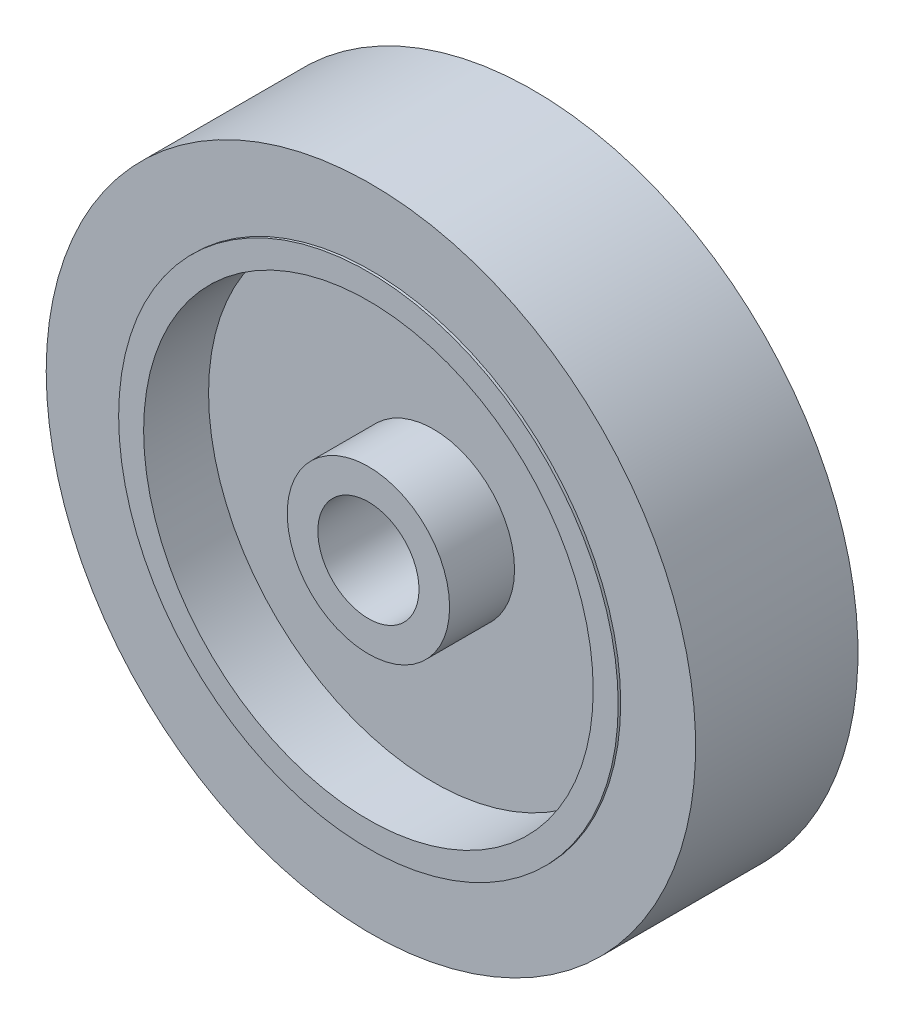
ISO-10303-21;
HEADER;
FILE_DESCRIPTION(('STEP AP214'),'2;1');
FILE_NAME('part.step','',(''),(''),'','','');
FILE_SCHEMA(('AUTOMOTIVE_DESIGN { 1 0 10303 214 1 1 1 1 }'));
ENDSEC;
DATA;
#1=APPLICATION_CONTEXT('core data for automotive mechanical design processes');
#2=APPLICATION_PROTOCOL_DEFINITION('international standard','automotive_design',2000,#1);
#3=PRODUCT_CONTEXT('',#1,'mechanical');
#4=PRODUCT('Part','Part','',(#3));
#5=PRODUCT_RELATED_PRODUCT_CATEGORY('part','',(#4));
#6=PRODUCT_DEFINITION_FORMATION('','',#4);
#7=PRODUCT_DEFINITION_CONTEXT('part definition',#1,'design');
#8=PRODUCT_DEFINITION('design','',#6,#7);
#9=PRODUCT_DEFINITION_SHAPE('','',#8);
#10=(LENGTH_UNIT() NAMED_UNIT(*) SI_UNIT(.MILLI.,.METRE.));
#11=(NAMED_UNIT(*) PLANE_ANGLE_UNIT() SI_UNIT($,.RADIAN.));
#12=(NAMED_UNIT(*) SI_UNIT($,.STERADIAN.) SOLID_ANGLE_UNIT());
#13=UNCERTAINTY_MEASURE_WITH_UNIT(LENGTH_MEASURE(1.E-05),#10,'distance_accuracy_value','');
#14=(GEOMETRIC_REPRESENTATION_CONTEXT(3) GLOBAL_UNCERTAINTY_ASSIGNED_CONTEXT((#13)) GLOBAL_UNIT_ASSIGNED_CONTEXT((#10,
#11,#12)) REPRESENTATION_CONTEXT('',''));
#15=CARTESIAN_POINT('',(0.,0.,0.));
#16=DIRECTION('',(0.,0.,1.));
#17=DIRECTION('',(1.,0.,0.));
#18=AXIS2_PLACEMENT_3D('',#15,#16,#17);
#19=CARTESIAN_POINT('',(0.,0.,6.5));
#20=DIRECTION('',(0.,0.,-1.));
#21=DIRECTION('',(-1.,0.,0.));
#22=AXIS2_PLACEMENT_3D('',#19,#20,#21);
#23=CYLINDRICAL_SURFACE('',#22,26.);
#24=CARTESIAN_POINT('',(0.,0.,6.5));
#25=DIRECTION('',(0.,0.,1.));
#26=DIRECTION('',(1.,0.,0.));
#27=AXIS2_PLACEMENT_3D('',#24,#25,#26);
#28=CIRCLE('',#27,26.);
#29=CARTESIAN_POINT('',(-26.,0.,6.5));
#30=VERTEX_POINT('',#29);
#31=EDGE_CURVE('E38',#30,#30,#28,.T.);
#32=CARTESIAN_POINT('',(0.,0.,-6.5));
#33=DIRECTION('',(0.,0.,1.));
#34=DIRECTION('',(1.,0.,0.));
#35=AXIS2_PLACEMENT_3D('',#32,#33,#34);
#36=CIRCLE('',#35,26.);
#37=CARTESIAN_POINT('',(-26.,0.,-6.5));
#38=VERTEX_POINT('',#37);
#39=EDGE_CURVE('E42',#38,#38,#36,.T.);
#40=CARTESIAN_POINT('',(-26.,0.,6.5));
#41=CARTESIAN_POINT('',(-26.,0.,6.36458333333333));
#42=CARTESIAN_POINT('',(-26.,0.,6.22916666666667));
#43=CARTESIAN_POINT('',(-26.,0.,5.95833333333333));
#44=CARTESIAN_POINT('',(-26.,0.,5.82291666666667));
#45=CARTESIAN_POINT('',(-26.,0.,5.55208333333333));
#46=CARTESIAN_POINT('',(-26.,0.,5.41666666666667));
#47=CARTESIAN_POINT('',(-26.,0.,5.14583333333333));
#48=CARTESIAN_POINT('',(-26.,0.,5.01041666666667));
#49=CARTESIAN_POINT('',(-26.,0.,4.73958333333333));
#50=CARTESIAN_POINT('',(-26.,0.,4.60416666666667));
#51=CARTESIAN_POINT('',(-26.,0.,4.33333333333333));
#52=CARTESIAN_POINT('',(-26.,0.,4.19791666666667));
#53=CARTESIAN_POINT('',(-26.,0.,3.92708333333333));
#54=CARTESIAN_POINT('',(-26.,0.,3.79166666666667));
#55=CARTESIAN_POINT('',(-26.,0.,3.52083333333333));
#56=CARTESIAN_POINT('',(-26.,0.,3.38541666666667));
#57=CARTESIAN_POINT('',(-26.,0.,3.11458333333333));
#58=CARTESIAN_POINT('',(-26.,0.,2.97916666666667));
#59=CARTESIAN_POINT('',(-26.,0.,2.70833333333333));
#60=CARTESIAN_POINT('',(-26.,0.,2.57291666666667));
#61=CARTESIAN_POINT('',(-26.,0.,2.30208333333333));
#62=CARTESIAN_POINT('',(-26.,0.,2.16666666666667));
#63=CARTESIAN_POINT('',(-26.,0.,1.89583333333333));
#64=CARTESIAN_POINT('',(-26.,0.,1.76041666666667));
#65=CARTESIAN_POINT('',(-26.,0.,1.48958333333333));
#66=CARTESIAN_POINT('',(-26.,0.,1.35416666666667));
#67=CARTESIAN_POINT('',(-26.,0.,1.08333333333333));
#68=CARTESIAN_POINT('',(-26.,0.,0.947916666666666));
#69=CARTESIAN_POINT('',(-26.,0.,0.677083333333332));
#70=CARTESIAN_POINT('',(-26.,0.,0.541666666666666));
#71=CARTESIAN_POINT('',(-26.,0.,0.270833333333333));
#72=CARTESIAN_POINT('',(-26.,0.,0.135416666666666));
#73=CARTESIAN_POINT('',(-26.,0.,-0.135416666666668));
#74=CARTESIAN_POINT('',(-26.,0.,-0.270833333333334));
#75=CARTESIAN_POINT('',(-26.,0.,-0.541666666666668));
#76=CARTESIAN_POINT('',(-26.,0.,-0.677083333333334));
#77=CARTESIAN_POINT('',(-26.,0.,-0.947916666666667));
#78=CARTESIAN_POINT('',(-26.,0.,-1.08333333333333));
#79=CARTESIAN_POINT('',(-26.,0.,-1.35416666666667));
#80=CARTESIAN_POINT('',(-26.,0.,-1.48958333333333));
#81=CARTESIAN_POINT('',(-26.,0.,-1.76041666666667));
#82=CARTESIAN_POINT('',(-26.,0.,-1.89583333333333));
#83=CARTESIAN_POINT('',(-26.,0.,-2.16666666666667));
#84=CARTESIAN_POINT('',(-26.,0.,-2.30208333333333));
#85=CARTESIAN_POINT('',(-26.,0.,-2.57291666666667));
#86=CARTESIAN_POINT('',(-26.,0.,-2.70833333333333));
#87=CARTESIAN_POINT('',(-26.,0.,-2.97916666666667));
#88=CARTESIAN_POINT('',(-26.,0.,-3.11458333333333));
#89=CARTESIAN_POINT('',(-26.,0.,-3.38541666666667));
#90=CARTESIAN_POINT('',(-26.,0.,-3.52083333333333));
#91=CARTESIAN_POINT('',(-26.,0.,-3.79166666666667));
#92=CARTESIAN_POINT('',(-26.,0.,-3.92708333333333));
#93=CARTESIAN_POINT('',(-26.,0.,-4.19791666666667));
#94=CARTESIAN_POINT('',(-26.,0.,-4.33333333333333));
#95=CARTESIAN_POINT('',(-26.,0.,-4.60416666666667));
#96=CARTESIAN_POINT('',(-26.,0.,-4.73958333333333));
#97=CARTESIAN_POINT('',(-26.,0.,-5.01041666666667));
#98=CARTESIAN_POINT('',(-26.,0.,-5.14583333333333));
#99=CARTESIAN_POINT('',(-26.,0.,-5.41666666666667));
#100=CARTESIAN_POINT('',(-26.,0.,-5.55208333333333));
#101=CARTESIAN_POINT('',(-26.,0.,-5.82291666666667));
#102=CARTESIAN_POINT('',(-26.,0.,-5.95833333333333));
#103=CARTESIAN_POINT('',(-26.,0.,-6.22916666666667));
#104=CARTESIAN_POINT('',(-26.,0.,-6.36458333333333));
#105=CARTESIAN_POINT('',(-26.,0.,-6.5));
#106=B_SPLINE_CURVE_WITH_KNOTS('',3,(#40,#41,#42,#43,#44,#45,#46,#47,#48,#49,#50,#51,#52,#53,
#54,#55,#56,#57,#58,#59,#60,#61,#62,#63,#64,#65,#66,#67,#68,#69,#70,#71,#72,#73,#74,#75,#76,#77,
#78,#79,#80,#81,#82,#83,#84,#85,#86,#87,#88,#89,#90,#91,#92,#93,#94,#95,#96,#97,#98,#99,#100,
#101,#102,#103,#104,#105),.UNSPECIFIED.,.F.,.F.,(4,2,2,2,2,2,2,2,2,2,2,2,2,2,2,2,2,2,2,2,2,2,2,
2,2,2,2,2,2,2,2,2,4),(0.,0.40625,0.8125,1.21875,1.625,2.03125,2.4375,2.84375,3.25,3.65625,
4.0625,4.46875,4.875,5.28125,5.6875,6.09375,6.5,6.90625,7.3125,7.71875,8.125,8.53125,8.9375,
9.34375,9.75,10.15625,10.5625,10.96875,11.375,11.78125,12.1875,12.59375,13.),.UNSPECIFIED.);
#107=EDGE_CURVE('BSEAM31',#30,#38,#106,.T.);
#108=ORIENTED_EDGE('',*,*,#31,.F.);
#109=ORIENTED_EDGE('',*,*,#39,.T.);
#110=ORIENTED_EDGE('',*,*,#107,.T.);
#111=ORIENTED_EDGE('',*,*,#107,.F.);
#112=EDGE_LOOP('',(#108,#110,#109,#111));
#113=FACE_BOUND('',#112,.T.);
#114=ADVANCED_FACE('F31',(#113),#23,.T.);
#115=CARTESIAN_POINT('',(0.,0.,6.5));
#116=DIRECTION('',(0.,0.,1.));
#117=DIRECTION('',(1.,0.,0.));
#118=AXIS2_PLACEMENT_3D('',#115,#116,#117);
#119=PLANE('',#118);
#120=CARTESIAN_POINT('',(0.,0.,6.5));
#121=DIRECTION('',(0.,0.,1.));
#122=DIRECTION('',(1.,0.,0.));
#123=AXIS2_PLACEMENT_3D('',#120,#121,#122);
#124=CIRCLE('',#123,20.);
#125=CARTESIAN_POINT('',(20.,0.,6.5));
#126=VERTEX_POINT('',#125);
#127=EDGE_CURVE('E48',#126,#126,#124,.T.);
#128=ORIENTED_EDGE('',*,*,#127,.F.);
#129=EDGE_LOOP('',(#128));
#130=FACE_BOUND('',#129,.T.);
#131=ORIENTED_EDGE('',*,*,#31,.T.);
#132=EDGE_LOOP('',(#131));
#133=FACE_BOUND('',#132,.T.);
#134=ADVANCED_FACE('F102',(#130,#133),#119,.T.);
#135=CARTESIAN_POINT('',(0.,0.,-6.5));
#136=DIRECTION('',(0.,0.,1.));
#137=DIRECTION('',(1.,0.,0.));
#138=AXIS2_PLACEMENT_3D('',#135,#136,#137);
#139=PLANE('',#138);
#140=CARTESIAN_POINT('',(0.,0.,-6.5));
#141=DIRECTION('',(0.,0.,1.));
#142=DIRECTION('',(1.,0.,0.));
#143=AXIS2_PLACEMENT_3D('',#140,#141,#142);
#144=CIRCLE('',#143,20.);
#145=CARTESIAN_POINT('',(20.,0.,-6.5));
#146=VERTEX_POINT('',#145);
#147=EDGE_CURVE('E10',#146,#146,#144,.F.);
#148=ORIENTED_EDGE('',*,*,#147,.F.);
#149=EDGE_LOOP('',(#148));
#150=FACE_BOUND('',#149,.T.);
#151=ORIENTED_EDGE('',*,*,#39,.F.);
#152=EDGE_LOOP('',(#151));
#153=FACE_BOUND('',#152,.T.);
#154=ADVANCED_FACE('F107',(#150,#153),#139,.F.);
#155=CARTESIAN_POINT('',(0.,0.,6.7));
#156=DIRECTION('',(0.,0.,1.));
#157=DIRECTION('',(1.,0.,0.));
#158=AXIS2_PLACEMENT_3D('',#155,#156,#157);
#159=PLANE('',#158);
#160=CARTESIAN_POINT('',(0.,0.,6.7));
#161=DIRECTION('',(0.,0.,1.));
#162=DIRECTION('',(1.,0.,0.));
#163=AXIS2_PLACEMENT_3D('',#160,#161,#162);
#164=CIRCLE('',#163,20.);
#165=CARTESIAN_POINT('',(20.,0.,6.7));
#166=VERTEX_POINT('',#165);
#167=EDGE_CURVE('E46',#166,#166,#164,.T.);
#168=ORIENTED_EDGE('',*,*,#167,.T.);
#169=EDGE_LOOP('',(#168));
#170=FACE_BOUND('',#169,.T.);
#171=CARTESIAN_POINT('',(0.,0.,6.7));
#172=DIRECTION('',(0.,0.,1.));
#173=DIRECTION('',(1.,0.,0.));
#174=AXIS2_PLACEMENT_3D('',#171,#172,#173);
#175=CIRCLE('',#174,18.);
#176=CARTESIAN_POINT('',(18.,0.,6.7));
#177=VERTEX_POINT('',#176);
#178=EDGE_CURVE('E51',#177,#177,#175,.T.);
#179=ORIENTED_EDGE('',*,*,#178,.F.);
#180=EDGE_LOOP('',(#179));
#181=FACE_BOUND('',#180,.T.);
#182=ADVANCED_FACE('F115',(#170,#181),#159,.T.);
#183=CARTESIAN_POINT('',(0.,0.,6.7));
#184=DIRECTION('',(0.,0.,-1.));
#185=DIRECTION('',(-1.,0.,0.));
#186=AXIS2_PLACEMENT_3D('',#183,#184,#185);
#187=CYLINDRICAL_SURFACE('',#186,20.);
#188=ORIENTED_EDGE('',*,*,#167,.F.);
#189=EDGE_LOOP('',(#188));
#190=FACE_BOUND('',#189,.T.);
#191=ORIENTED_EDGE('',*,*,#127,.T.);
#192=EDGE_LOOP('',(#191));
#193=FACE_BOUND('',#192,.T.);
#194=ADVANCED_FACE('F120',(#190,#193),#187,.T.);
#195=CARTESIAN_POINT('',(0.,0.,6.7));
#196=DIRECTION('',(0.,0.,-1.));
#197=DIRECTION('',(-1.,0.,0.));
#198=AXIS2_PLACEMENT_3D('',#195,#196,#197);
#199=CYLINDRICAL_SURFACE('',#198,18.);
#200=ORIENTED_EDGE('',*,*,#178,.T.);
#201=EDGE_LOOP('',(#200));
#202=FACE_BOUND('',#201,.T.);
#203=CARTESIAN_POINT('',(0.,0.,1.5));
#204=DIRECTION('',(0.,0.,1.));
#205=DIRECTION('',(1.,0.,0.));
#206=AXIS2_PLACEMENT_3D('',#203,#204,#205);
#207=CIRCLE('',#206,18.);
#208=CARTESIAN_POINT('',(18.,0.,1.5));
#209=VERTEX_POINT('',#208);
#210=EDGE_CURVE('E65',#209,#209,#207,.T.);
#211=ORIENTED_EDGE('',*,*,#210,.F.);
#212=EDGE_LOOP('',(#211));
#213=FACE_BOUND('',#212,.T.);
#214=ADVANCED_FACE('F125',(#202,#213),#199,.F.);
#215=CARTESIAN_POINT('',(0.,0.,-6.7));
#216=DIRECTION('',(0.,0.,-1.));
#217=DIRECTION('',(-1.,0.,0.));
#218=AXIS2_PLACEMENT_3D('',#215,#216,#217);
#219=PLANE('',#218);
#220=CARTESIAN_POINT('',(0.,0.,-6.7));
#221=DIRECTION('',(0.,0.,-1.));
#222=DIRECTION('',(-1.,0.,0.));
#223=AXIS2_PLACEMENT_3D('',#220,#221,#222);
#224=CIRCLE('',#223,20.);
#225=CARTESIAN_POINT('',(-20.,0.,-6.7));
#226=VERTEX_POINT('',#225);
#227=EDGE_CURVE('E56',#226,#226,#224,.T.);
#228=ORIENTED_EDGE('',*,*,#227,.T.);
#229=EDGE_LOOP('',(#228));
#230=FACE_BOUND('',#229,.T.);
#231=CARTESIAN_POINT('',(0.,0.,-6.7));
#232=DIRECTION('',(0.,0.,-1.));
#233=DIRECTION('',(-1.,0.,0.));
#234=AXIS2_PLACEMENT_3D('',#231,#232,#233);
#235=CIRCLE('',#234,18.);
#236=CARTESIAN_POINT('',(-18.,0.,-6.7));
#237=VERTEX_POINT('',#236);
#238=EDGE_CURVE('E59',#237,#237,#235,.T.);
#239=ORIENTED_EDGE('',*,*,#238,.F.);
#240=EDGE_LOOP('',(#239));
#241=FACE_BOUND('',#240,.T.);
#242=ADVANCED_FACE('F130',(#230,#241),#219,.T.);
#243=CARTESIAN_POINT('',(0.,0.,-6.7));
#244=DIRECTION('',(0.,0.,1.));
#245=DIRECTION('',(1.,0.,0.));
#246=AXIS2_PLACEMENT_3D('',#243,#244,#245);
#247=CYLINDRICAL_SURFACE('',#246,20.);
#248=ORIENTED_EDGE('',*,*,#227,.F.);
#249=EDGE_LOOP('',(#248));
#250=FACE_BOUND('',#249,.T.);
#251=ORIENTED_EDGE('',*,*,#147,.T.);
#252=EDGE_LOOP('',(#251));
#253=FACE_BOUND('',#252,.T.);
#254=ADVANCED_FACE('F132',(#250,#253),#247,.T.);
#255=CARTESIAN_POINT('',(0.,0.,-6.7));
#256=DIRECTION('',(0.,0.,1.));
#257=DIRECTION('',(1.,0.,0.));
#258=AXIS2_PLACEMENT_3D('',#255,#256,#257);
#259=CYLINDRICAL_SURFACE('',#258,18.);
#260=ORIENTED_EDGE('',*,*,#238,.T.);
#261=EDGE_LOOP('',(#260));
#262=FACE_BOUND('',#261,.T.);
#263=CARTESIAN_POINT('',(0.,0.,-1.5));
#264=DIRECTION('',(0.,0.,-1.));
#265=DIRECTION('',(-1.,0.,0.));
#266=AXIS2_PLACEMENT_3D('',#263,#264,#265);
#267=CIRCLE('',#266,18.);
#268=CARTESIAN_POINT('',(-18.,0.,-1.5));
#269=VERTEX_POINT('',#268);
#270=EDGE_CURVE('E62',#269,#269,#267,.T.);
#271=ORIENTED_EDGE('',*,*,#270,.F.);
#272=EDGE_LOOP('',(#271));
#273=FACE_BOUND('',#272,.T.);
#274=ADVANCED_FACE('F135',(#262,#273),#259,.F.);
#275=CARTESIAN_POINT('',(0.,0.,-1.5));
#276=DIRECTION('',(0.,0.,-1.));
#277=DIRECTION('',(-1.,0.,0.));
#278=AXIS2_PLACEMENT_3D('',#275,#276,#277);
#279=PLANE('',#278);
#280=CARTESIAN_POINT('',(0.,0.,-1.5));
#281=DIRECTION('',(0.,0.,-1.));
#282=DIRECTION('',(-1.,0.,0.));
#283=AXIS2_PLACEMENT_3D('',#280,#281,#282);
#284=CIRCLE('',#283,6.5);
#285=CARTESIAN_POINT('',(-6.5,0.,-1.5));
#286=VERTEX_POINT('',#285);
#287=EDGE_CURVE('E68',#286,#286,#284,.F.);
#288=ORIENTED_EDGE('',*,*,#287,.T.);
#289=EDGE_LOOP('',(#288));
#290=FACE_BOUND('',#289,.T.);
#291=ORIENTED_EDGE('',*,*,#270,.T.);
#292=EDGE_LOOP('',(#291));
#293=FACE_BOUND('',#292,.T.);
#294=ADVANCED_FACE('F142',(#290,#293),#279,.T.);
#295=CARTESIAN_POINT('',(0.,0.,1.5));
#296=DIRECTION('',(0.,0.,1.));
#297=DIRECTION('',(1.,0.,0.));
#298=AXIS2_PLACEMENT_3D('',#295,#296,#297);
#299=PLANE('',#298);
#300=CARTESIAN_POINT('',(0.,0.,1.5));
#301=DIRECTION('',(0.,0.,1.));
#302=DIRECTION('',(1.,0.,0.));
#303=AXIS2_PLACEMENT_3D('',#300,#301,#302);
#304=CIRCLE('',#303,6.5);
#305=CARTESIAN_POINT('',(6.5,0.,1.5));
#306=VERTEX_POINT('',#305);
#307=EDGE_CURVE('E34',#306,#306,#304,.F.);
#308=ORIENTED_EDGE('',*,*,#307,.T.);
#309=EDGE_LOOP('',(#308));
#310=FACE_BOUND('',#309,.T.);
#311=ORIENTED_EDGE('',*,*,#210,.T.);
#312=EDGE_LOOP('',(#311));
#313=FACE_BOUND('',#312,.T.);
#314=ADVANCED_FACE('F146',(#310,#313),#299,.T.);
#315=CARTESIAN_POINT('',(0.,0.,-25.0847763108502));
#316=DIRECTION('',(0.,0.,1.));
#317=DIRECTION('',(1.,0.,0.));
#318=AXIS2_PLACEMENT_3D('',#315,#316,#317);
#319=CYLINDRICAL_SURFACE('',#318,6.5);
#320=ORIENTED_EDGE('',*,*,#307,.F.);
#321=EDGE_LOOP('',(#320));
#322=FACE_BOUND('',#321,.T.);
#323=CARTESIAN_POINT('',(0.,0.,6.7));
#324=DIRECTION('',(0.,0.,1.));
#325=DIRECTION('',(1.,0.,0.));
#326=AXIS2_PLACEMENT_3D('',#323,#324,#325);
#327=CIRCLE('',#326,6.5);
#328=CARTESIAN_POINT('',(6.5,0.,6.7));
#329=VERTEX_POINT('',#328);
#330=EDGE_CURVE('E78',#329,#329,#327,.F.);
#331=ORIENTED_EDGE('',*,*,#330,.T.);
#332=EDGE_LOOP('',(#331));
#333=FACE_BOUND('',#332,.T.);
#334=ADVANCED_FACE('F100',(#322,#333),#319,.T.);
#335=CARTESIAN_POINT('',(0.,0.,6.7));
#336=DIRECTION('',(0.,0.,1.));
#337=DIRECTION('',(1.,0.,0.));
#338=AXIS2_PLACEMENT_3D('',#335,#336,#337);
#339=PLANE('',#338);
#340=ORIENTED_EDGE('',*,*,#330,.F.);
#341=EDGE_LOOP('',(#340));
#342=FACE_BOUND('',#341,.T.);
#343=CARTESIAN_POINT('',(0.,0.,6.7));
#344=DIRECTION('',(0.,0.,1.));
#345=DIRECTION('',(1.,0.,0.));
#346=AXIS2_PLACEMENT_3D('',#343,#344,#345);
#347=CIRCLE('',#346,4.05);
#348=CARTESIAN_POINT('',(4.05,0.,6.7));
#349=VERTEX_POINT('',#348);
#350=EDGE_CURVE('E75',#349,#349,#347,.F.);
#351=ORIENTED_EDGE('',*,*,#350,.T.);
#352=EDGE_LOOP('',(#351));
#353=FACE_BOUND('',#352,.T.);
#354=ADVANCED_FACE('F84',(#342,#353),#339,.T.);
#355=ORIENTED_EDGE('',*,*,#287,.F.);
#356=EDGE_LOOP('',(#355));
#357=FACE_BOUND('',#356,.T.);
#358=CARTESIAN_POINT('',(0.,0.,-6.7));
#359=DIRECTION('',(0.,0.,-1.));
#360=DIRECTION('',(-1.,0.,0.));
#361=AXIS2_PLACEMENT_3D('',#358,#359,#360);
#362=CIRCLE('',#361,6.5);
#363=CARTESIAN_POINT('',(-6.5,0.,-6.7));
#364=VERTEX_POINT('',#363);
#365=EDGE_CURVE('E74',#364,#364,#362,.T.);
#366=ORIENTED_EDGE('',*,*,#365,.F.);
#367=EDGE_LOOP('',(#366));
#368=FACE_BOUND('',#367,.T.);
#369=ADVANCED_FACE('F89',(#357,#368),#319,.T.);
#370=CARTESIAN_POINT('',(0.,0.,-25.0847763108502));
#371=DIRECTION('',(0.,0.,1.));
#372=DIRECTION('',(1.,0.,0.));
#373=AXIS2_PLACEMENT_3D('',#370,#371,#372);
#374=CYLINDRICAL_SURFACE('',#373,4.05);
#375=CARTESIAN_POINT('',(0.,0.,-6.7));
#376=DIRECTION('',(0.,0.,-1.));
#377=DIRECTION('',(-1.,0.,0.));
#378=AXIS2_PLACEMENT_3D('',#375,#376,#377);
#379=CIRCLE('',#378,4.05);
#380=CARTESIAN_POINT('',(-4.05,0.,-6.7));
#381=VERTEX_POINT('',#380);
#382=EDGE_CURVE('E71',#381,#381,#379,.T.);
#383=ORIENTED_EDGE('',*,*,#382,.T.);
#384=EDGE_LOOP('',(#383));
#385=FACE_BOUND('',#384,.T.);
#386=ORIENTED_EDGE('',*,*,#350,.F.);
#387=EDGE_LOOP('',(#386));
#388=FACE_BOUND('',#387,.T.);
#389=ADVANCED_FACE('F86',(#385,#388),#374,.F.);
#390=CARTESIAN_POINT('',(0.,0.,-6.7));
#391=DIRECTION('',(0.,0.,-1.));
#392=DIRECTION('',(-1.,0.,0.));
#393=AXIS2_PLACEMENT_3D('',#390,#391,#392);
#394=PLANE('',#393);
#395=ORIENTED_EDGE('',*,*,#382,.F.);
#396=EDGE_LOOP('',(#395));
#397=FACE_BOUND('',#396,.T.);
#398=ORIENTED_EDGE('',*,*,#365,.T.);
#399=EDGE_LOOP('',(#398));
#400=FACE_BOUND('',#399,.T.);
#401=ADVANCED_FACE('F88',(#397,#400),#394,.T.);
#402=CLOSED_SHELL('',(#114,#134,#154,#182,#194,#214,#242,#254,#274,#294,#314,#334,#354,#369,
#389,#401));
#403=MANIFOLD_SOLID_BREP('B2',#402);
#404=ADVANCED_BREP_SHAPE_REPRESENTATION('',(#18,#403),#14);
#405=SHAPE_DEFINITION_REPRESENTATION(#9,#404);
ENDSEC;
END-ISO-10303-21;
